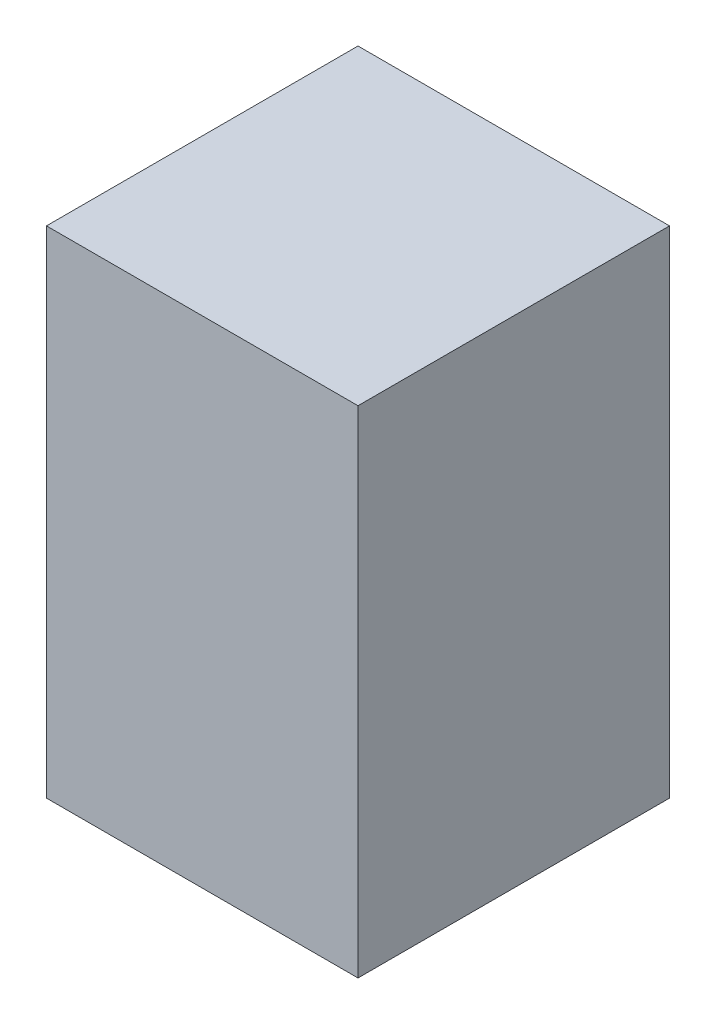
ISO-10303-21;
HEADER;
FILE_DESCRIPTION(('STEP AP214'),'2;1');
FILE_NAME('part.step','',(''),(''),'','','');
FILE_SCHEMA(('AUTOMOTIVE_DESIGN { 1 0 10303 214 1 1 1 1 }'));
ENDSEC;
DATA;
#1=APPLICATION_CONTEXT('core data for automotive mechanical design processes');
#2=APPLICATION_PROTOCOL_DEFINITION('international standard','automotive_design',2000,#1);
#3=PRODUCT_CONTEXT('',#1,'mechanical');
#4=PRODUCT('Part','Part','',(#3));
#5=PRODUCT_RELATED_PRODUCT_CATEGORY('part','',(#4));
#6=PRODUCT_DEFINITION_FORMATION('','',#4);
#7=PRODUCT_DEFINITION_CONTEXT('part definition',#1,'design');
#8=PRODUCT_DEFINITION('design','',#6,#7);
#9=PRODUCT_DEFINITION_SHAPE('','',#8);
#10=(LENGTH_UNIT() NAMED_UNIT(*) SI_UNIT(.MILLI.,.METRE.));
#11=(NAMED_UNIT(*) PLANE_ANGLE_UNIT() SI_UNIT($,.RADIAN.));
#12=(NAMED_UNIT(*) SI_UNIT($,.STERADIAN.) SOLID_ANGLE_UNIT());
#13=UNCERTAINTY_MEASURE_WITH_UNIT(LENGTH_MEASURE(1.E-05),#10,'distance_accuracy_value','');
#14=(GEOMETRIC_REPRESENTATION_CONTEXT(3) GLOBAL_UNCERTAINTY_ASSIGNED_CONTEXT((#13)) GLOBAL_UNIT_ASSIGNED_CONTEXT((#10,
#11,#12)) REPRESENTATION_CONTEXT('',''));
#15=CARTESIAN_POINT('',(0.,0.,0.));
#16=DIRECTION('',(0.,0.,1.));
#17=DIRECTION('',(1.,0.,0.));
#18=AXIS2_PLACEMENT_3D('',#15,#16,#17);
#19=CARTESIAN_POINT('',(0.11,0.35,0.11));
#20=DIRECTION('',(-1.,0.,0.));
#21=DIRECTION('',(0.,0.,1.));
#22=AXIS2_PLACEMENT_3D('',#19,#20,#21);
#23=PLANE('',#22);
#24=DIRECTION('',(0.,0.,-1.));
#25=VECTOR('',#24,1.);
#26=CARTESIAN_POINT('',(0.11,0.,0.11));
#27=LINE('',#26,#25);
#28=CARTESIAN_POINT('',(0.11,0.,0.11));
#29=VERTEX_POINT('',#28);
#30=CARTESIAN_POINT('',(0.11,0.,-0.11));
#31=VERTEX_POINT('',#30);
#32=EDGE_CURVE('E96',#29,#31,#27,.T.);
#33=ORIENTED_EDGE('',*,*,#32,.T.);
#34=DIRECTION('',(0.,-1.,0.));
#35=VECTOR('',#34,1.);
#36=CARTESIAN_POINT('',(0.11,0.35,-0.11));
#37=LINE('',#36,#35);
#38=CARTESIAN_POINT('',(0.11,0.35,-0.11));
#39=VERTEX_POINT('',#38);
#40=EDGE_CURVE('E11',#39,#31,#37,.T.);
#41=ORIENTED_EDGE('',*,*,#40,.F.);
#42=DIRECTION('',(0.,0.,-1.));
#43=VECTOR('',#42,1.);
#44=CARTESIAN_POINT('',(0.11,0.35,0.11));
#45=LINE('',#44,#43);
#46=CARTESIAN_POINT('',(0.11,0.35,0.11));
#47=VERTEX_POINT('',#46);
#48=EDGE_CURVE('E84',#47,#39,#45,.T.);
#49=ORIENTED_EDGE('',*,*,#48,.F.);
#50=DIRECTION('',(0.,-1.,0.));
#51=VECTOR('',#50,1.);
#52=CARTESIAN_POINT('',(0.11,0.35,0.11));
#53=LINE('',#52,#51);
#54=EDGE_CURVE('E92',#47,#29,#53,.T.);
#55=ORIENTED_EDGE('',*,*,#54,.T.);
#56=EDGE_LOOP('',(#33,#41,#49,#55));
#57=FACE_BOUND('',#56,.T.);
#58=ADVANCED_FACE('F33',(#57),#23,.F.);
#59=CARTESIAN_POINT('',(-0.11,0.35,-0.11));
#60=DIRECTION('',(0.,0.,1.));
#61=DIRECTION('',(1.,0.,0.));
#62=AXIS2_PLACEMENT_3D('',#59,#60,#61);
#63=PLANE('',#62);
#64=DIRECTION('',(-1.,0.,0.));
#65=VECTOR('',#64,1.);
#66=CARTESIAN_POINT('',(-0.11,0.,-0.11));
#67=LINE('',#66,#65);
#68=CARTESIAN_POINT('',(-0.11,0.,-0.11));
#69=VERTEX_POINT('',#68);
#70=EDGE_CURVE('E88',#31,#69,#67,.T.);
#71=ORIENTED_EDGE('',*,*,#70,.T.);
#72=DIRECTION('',(0.,-1.,0.));
#73=VECTOR('',#72,1.);
#74=CARTESIAN_POINT('',(-0.11,0.35,-0.11));
#75=LINE('',#74,#73);
#76=CARTESIAN_POINT('',(-0.11,0.35,-0.11));
#77=VERTEX_POINT('',#76);
#78=EDGE_CURVE('E41',#77,#69,#75,.T.);
#79=ORIENTED_EDGE('',*,*,#78,.F.);
#80=DIRECTION('',(-1.,0.,0.));
#81=VECTOR('',#80,1.);
#82=CARTESIAN_POINT('',(-0.11,0.35,-0.11));
#83=LINE('',#82,#81);
#84=EDGE_CURVE('E79',#39,#77,#83,.T.);
#85=ORIENTED_EDGE('',*,*,#84,.F.);
#86=ORIENTED_EDGE('',*,*,#40,.T.);
#87=EDGE_LOOP('',(#71,#79,#85,#86));
#88=FACE_BOUND('',#87,.T.);
#89=ADVANCED_FACE('F87',(#88),#63,.F.);
#90=CARTESIAN_POINT('',(-0.11,0.35,0.11));
#91=DIRECTION('',(1.,0.,0.));
#92=DIRECTION('',(0.,0.,-1.));
#93=AXIS2_PLACEMENT_3D('',#90,#91,#92);
#94=PLANE('',#93);
#95=DIRECTION('',(0.,0.,1.));
#96=VECTOR('',#95,1.);
#97=CARTESIAN_POINT('',(-0.11,0.,0.11));
#98=LINE('',#97,#96);
#99=CARTESIAN_POINT('',(-0.11,0.,0.11));
#100=VERTEX_POINT('',#99);
#101=EDGE_CURVE('E66',#69,#100,#98,.T.);
#102=ORIENTED_EDGE('',*,*,#101,.T.);
#103=DIRECTION('',(0.,-1.,0.));
#104=VECTOR('',#103,1.);
#105=CARTESIAN_POINT('',(-0.11,0.35,0.11));
#106=LINE('',#105,#104);
#107=CARTESIAN_POINT('',(-0.11,0.35,0.11));
#108=VERTEX_POINT('',#107);
#109=EDGE_CURVE('E89',#108,#100,#106,.T.);
#110=ORIENTED_EDGE('',*,*,#109,.F.);
#111=DIRECTION('',(0.,0.,1.));
#112=VECTOR('',#111,1.);
#113=CARTESIAN_POINT('',(-0.11,0.35,0.11));
#114=LINE('',#113,#112);
#115=EDGE_CURVE('E82',#77,#108,#114,.T.);
#116=ORIENTED_EDGE('',*,*,#115,.F.);
#117=ORIENTED_EDGE('',*,*,#78,.T.);
#118=EDGE_LOOP('',(#102,#110,#116,#117));
#119=FACE_BOUND('',#118,.T.);
#120=ADVANCED_FACE('F90',(#119),#94,.F.);
#121=CARTESIAN_POINT('',(-0.11,0.35,0.11));
#122=DIRECTION('',(0.,0.,-1.));
#123=DIRECTION('',(-1.,0.,0.));
#124=AXIS2_PLACEMENT_3D('',#121,#122,#123);
#125=PLANE('',#124);
#126=DIRECTION('',(1.,0.,0.));
#127=VECTOR('',#126,1.);
#128=CARTESIAN_POINT('',(-0.11,0.,0.11));
#129=LINE('',#128,#127);
#130=EDGE_CURVE('E72',#100,#29,#129,.T.);
#131=ORIENTED_EDGE('',*,*,#130,.T.);
#132=ORIENTED_EDGE('',*,*,#54,.F.);
#133=DIRECTION('',(1.,0.,0.));
#134=VECTOR('',#133,1.);
#135=CARTESIAN_POINT('',(-0.11,0.35,0.11));
#136=LINE('',#135,#134);
#137=EDGE_CURVE('E49',#108,#47,#136,.T.);
#138=ORIENTED_EDGE('',*,*,#137,.F.);
#139=ORIENTED_EDGE('',*,*,#109,.T.);
#140=EDGE_LOOP('',(#131,#132,#138,#139));
#141=FACE_BOUND('',#140,.T.);
#142=ADVANCED_FACE('F103',(#141),#125,.F.);
#143=CARTESIAN_POINT('',(0.,0.35,0.));
#144=DIRECTION('',(0.,-1.,0.));
#145=DIRECTION('',(0.,0.,-1.));
#146=AXIS2_PLACEMENT_3D('',#143,#144,#145);
#147=PLANE('',#146);
#148=ORIENTED_EDGE('',*,*,#48,.T.);
#149=ORIENTED_EDGE('',*,*,#84,.T.);
#150=ORIENTED_EDGE('',*,*,#115,.T.);
#151=ORIENTED_EDGE('',*,*,#137,.T.);
#152=EDGE_LOOP('',(#148,#149,#150,#151));
#153=FACE_BOUND('',#152,.T.);
#154=ADVANCED_FACE('F80',(#153),#147,.F.);
#155=CARTESIAN_POINT('',(0.,0.,0.));
#156=DIRECTION('',(0.,-1.,0.));
#157=DIRECTION('',(0.,0.,-1.));
#158=AXIS2_PLACEMENT_3D('',#155,#156,#157);
#159=PLANE('',#158);
#160=ORIENTED_EDGE('',*,*,#32,.F.);
#161=ORIENTED_EDGE('',*,*,#130,.F.);
#162=ORIENTED_EDGE('',*,*,#101,.F.);
#163=ORIENTED_EDGE('',*,*,#70,.F.);
#164=EDGE_LOOP('',(#160,#161,#162,#163));
#165=FACE_BOUND('',#164,.T.);
#166=ADVANCED_FACE('F106',(#165),#159,.T.);
#167=CLOSED_SHELL('',(#58,#89,#120,#142,#154,#166));
#168=MANIFOLD_SOLID_BREP('B2',#167);
#169=ADVANCED_BREP_SHAPE_REPRESENTATION('',(#18,#168),#14);
#170=SHAPE_DEFINITION_REPRESENTATION(#9,#169);
ENDSEC;
END-ISO-10303-21;
